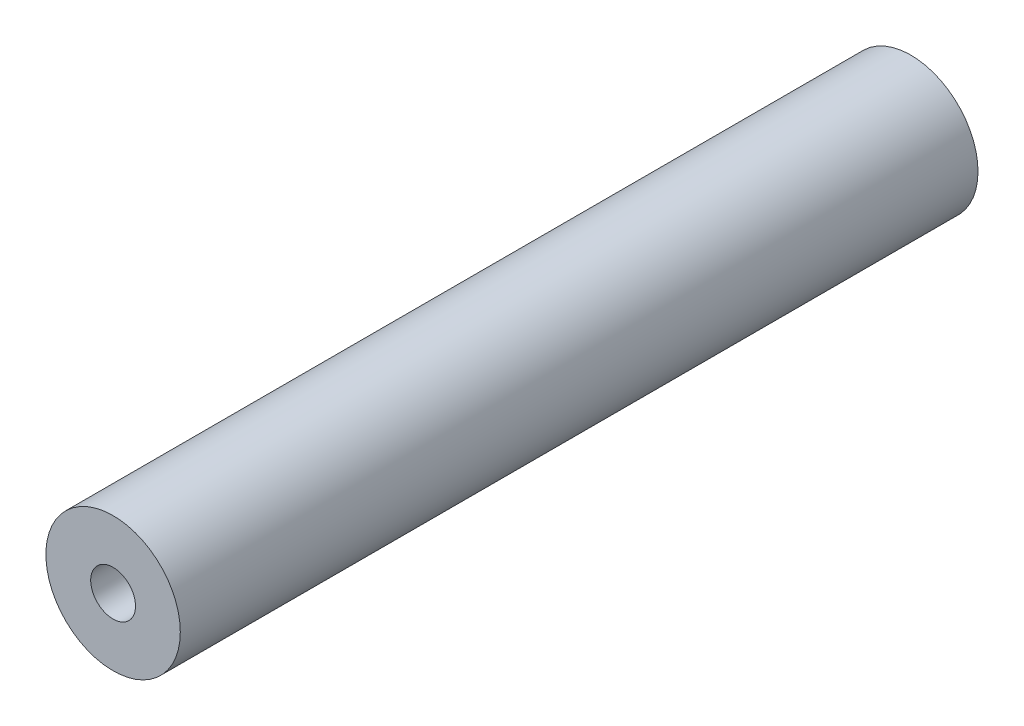
ISO-10303-21;
HEADER;
FILE_DESCRIPTION(('STEP AP214'),'2;1');
FILE_NAME('part.step','',(''),(''),'','','');
FILE_SCHEMA(('AUTOMOTIVE_DESIGN { 1 0 10303 214 1 1 1 1 }'));
ENDSEC;
DATA;
#1=APPLICATION_CONTEXT('core data for automotive mechanical design processes');
#2=APPLICATION_PROTOCOL_DEFINITION('international standard','automotive_design',2000,#1);
#3=PRODUCT_CONTEXT('',#1,'mechanical');
#4=PRODUCT('Part','Part','',(#3));
#5=PRODUCT_RELATED_PRODUCT_CATEGORY('part','',(#4));
#6=PRODUCT_DEFINITION_FORMATION('','',#4);
#7=PRODUCT_DEFINITION_CONTEXT('part definition',#1,'design');
#8=PRODUCT_DEFINITION('design','',#6,#7);
#9=PRODUCT_DEFINITION_SHAPE('','',#8);
#10=(LENGTH_UNIT() NAMED_UNIT(*) SI_UNIT(.MILLI.,.METRE.));
#11=(NAMED_UNIT(*) PLANE_ANGLE_UNIT() SI_UNIT($,.RADIAN.));
#12=(NAMED_UNIT(*) SI_UNIT($,.STERADIAN.) SOLID_ANGLE_UNIT());
#13=UNCERTAINTY_MEASURE_WITH_UNIT(LENGTH_MEASURE(1.E-05),#10,'distance_accuracy_value','');
#14=(GEOMETRIC_REPRESENTATION_CONTEXT(3) GLOBAL_UNCERTAINTY_ASSIGNED_CONTEXT((#13)) GLOBAL_UNIT_ASSIGNED_CONTEXT((#10,
#11,#12)) REPRESENTATION_CONTEXT('',''));
#15=CARTESIAN_POINT('',(0.,0.,0.));
#16=DIRECTION('',(0.,0.,1.));
#17=DIRECTION('',(1.,0.,0.));
#18=AXIS2_PLACEMENT_3D('',#15,#16,#17);
#19=CARTESIAN_POINT('',(0.,0.,-89.));
#20=DIRECTION('',(0.,0.,1.));
#21=DIRECTION('',(1.,0.,0.));
#22=AXIS2_PLACEMENT_3D('',#19,#20,#21);
#23=CYLINDRICAL_SURFACE('',#22,7.5);
#24=CARTESIAN_POINT('',(0.,0.,-89.));
#25=DIRECTION('',(0.,0.,1.));
#26=DIRECTION('',(1.,0.,0.));
#27=AXIS2_PLACEMENT_3D('',#24,#25,#26);
#28=CIRCLE('',#27,7.5);
#29=CARTESIAN_POINT('',(7.5,0.,-89.));
#30=VERTEX_POINT('',#29);
#31=EDGE_CURVE('E10',#30,#30,#28,.T.);
#32=ORIENTED_EDGE('',*,*,#31,.T.);
#33=EDGE_LOOP('',(#32));
#34=FACE_BOUND('',#33,.T.);
#35=CARTESIAN_POINT('',(0.,0.,0.));
#36=DIRECTION('',(0.,0.,1.));
#37=DIRECTION('',(1.,0.,0.));
#38=AXIS2_PLACEMENT_3D('',#35,#36,#37);
#39=CIRCLE('',#38,7.5);
#40=CARTESIAN_POINT('',(7.5,0.,0.));
#41=VERTEX_POINT('',#40);
#42=EDGE_CURVE('E33',#41,#41,#39,.T.);
#43=ORIENTED_EDGE('',*,*,#42,.F.);
#44=EDGE_LOOP('',(#43));
#45=FACE_BOUND('',#44,.T.);
#46=ADVANCED_FACE('F30',(#34,#45),#23,.T.);
#47=CARTESIAN_POINT('',(0.,0.,-89.));
#48=DIRECTION('',(0.,0.,1.));
#49=DIRECTION('',(1.,0.,0.));
#50=AXIS2_PLACEMENT_3D('',#47,#48,#49);
#51=PLANE('',#50);
#52=CARTESIAN_POINT('',(0.,0.,-89.));
#53=DIRECTION('',(0.,0.,1.));
#54=DIRECTION('',(1.,0.,0.));
#55=AXIS2_PLACEMENT_3D('',#52,#53,#54);
#56=CIRCLE('',#55,2.5);
#57=CARTESIAN_POINT('',(2.5,0.,-89.));
#58=VERTEX_POINT('',#57);
#59=EDGE_CURVE('E40',#58,#58,#56,.T.);
#60=ORIENTED_EDGE('',*,*,#59,.T.);
#61=EDGE_LOOP('',(#60));
#62=FACE_BOUND('',#61,.T.);
#63=ORIENTED_EDGE('',*,*,#31,.F.);
#64=EDGE_LOOP('',(#63));
#65=FACE_BOUND('',#64,.T.);
#66=ADVANCED_FACE('F48',(#62,#65),#51,.F.);
#67=CARTESIAN_POINT('',(0.,0.,0.));
#68=DIRECTION('',(0.,0.,1.));
#69=DIRECTION('',(1.,0.,0.));
#70=AXIS2_PLACEMENT_3D('',#67,#68,#69);
#71=PLANE('',#70);
#72=CARTESIAN_POINT('',(0.,0.,0.));
#73=DIRECTION('',(0.,0.,1.));
#74=DIRECTION('',(1.,0.,0.));
#75=AXIS2_PLACEMENT_3D('',#72,#73,#74);
#76=CIRCLE('',#75,2.5);
#77=CARTESIAN_POINT('',(2.5,0.,0.));
#78=VERTEX_POINT('',#77);
#79=EDGE_CURVE('E42',#78,#78,#76,.T.);
#80=ORIENTED_EDGE('',*,*,#79,.F.);
#81=EDGE_LOOP('',(#80));
#82=FACE_BOUND('',#81,.T.);
#83=ORIENTED_EDGE('',*,*,#42,.T.);
#84=EDGE_LOOP('',(#83));
#85=FACE_BOUND('',#84,.T.);
#86=ADVANCED_FACE('F54',(#82,#85),#71,.T.);
#87=CARTESIAN_POINT('',(0.,0.,-89.));
#88=DIRECTION('',(0.,0.,1.));
#89=DIRECTION('',(1.,0.,0.));
#90=AXIS2_PLACEMENT_3D('',#87,#88,#89);
#91=CYLINDRICAL_SURFACE('',#90,2.5);
#92=ORIENTED_EDGE('',*,*,#59,.F.);
#93=EDGE_LOOP('',(#92));
#94=FACE_BOUND('',#93,.T.);
#95=ORIENTED_EDGE('',*,*,#79,.T.);
#96=EDGE_LOOP('',(#95));
#97=FACE_BOUND('',#96,.T.);
#98=ADVANCED_FACE('F51',(#94,#97),#91,.F.);
#99=CLOSED_SHELL('',(#46,#66,#86,#98));
#100=MANIFOLD_SOLID_BREP('B2',#99);
#101=ADVANCED_BREP_SHAPE_REPRESENTATION('',(#18,#100),#14);
#102=SHAPE_DEFINITION_REPRESENTATION(#9,#101);
ENDSEC;
END-ISO-10303-21;
